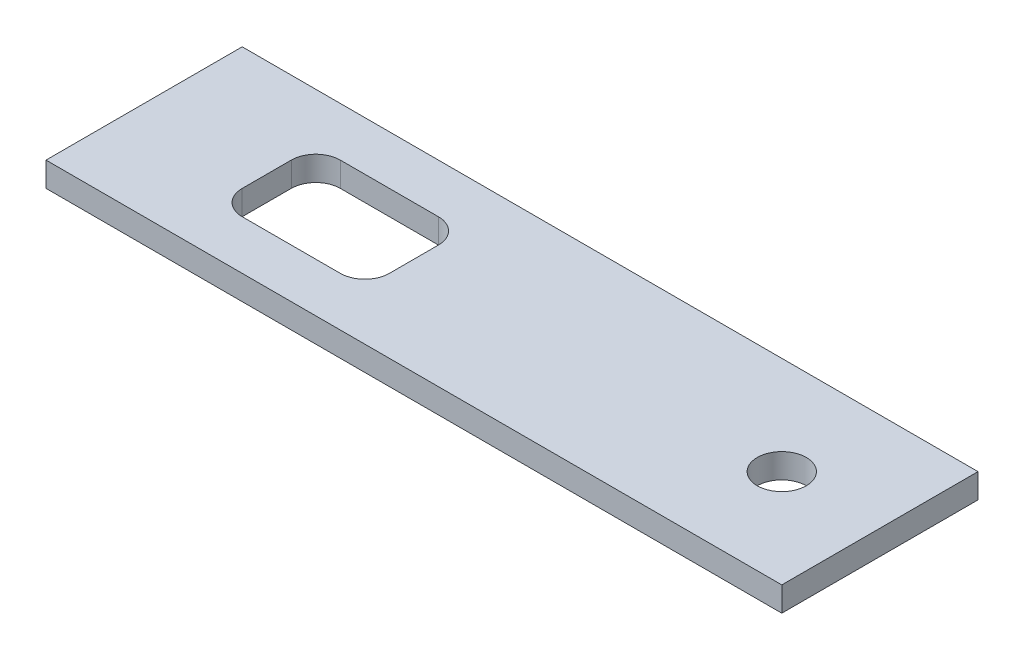
ISO-10303-21;
HEADER;
FILE_DESCRIPTION(('STEP AP214'),'2;1');
FILE_NAME('part.step','',(''),(''),'','','');
FILE_SCHEMA(('AUTOMOTIVE_DESIGN { 1 0 10303 214 1 1 1 1 }'));
ENDSEC;
DATA;
#1=APPLICATION_CONTEXT('core data for automotive mechanical design processes');
#2=APPLICATION_PROTOCOL_DEFINITION('international standard','automotive_design',2000,#1);
#3=PRODUCT_CONTEXT('',#1,'mechanical');
#4=PRODUCT('Part','Part','',(#3));
#5=PRODUCT_RELATED_PRODUCT_CATEGORY('part','',(#4));
#6=PRODUCT_DEFINITION_FORMATION('','',#4);
#7=PRODUCT_DEFINITION_CONTEXT('part definition',#1,'design');
#8=PRODUCT_DEFINITION('design','',#6,#7);
#9=PRODUCT_DEFINITION_SHAPE('','',#8);
#10=(LENGTH_UNIT() NAMED_UNIT(*) SI_UNIT(.MILLI.,.METRE.));
#11=(NAMED_UNIT(*) PLANE_ANGLE_UNIT() SI_UNIT($,.RADIAN.));
#12=(NAMED_UNIT(*) SI_UNIT($,.STERADIAN.) SOLID_ANGLE_UNIT());
#13=UNCERTAINTY_MEASURE_WITH_UNIT(LENGTH_MEASURE(1.E-05),#10,'distance_accuracy_value','');
#14=(GEOMETRIC_REPRESENTATION_CONTEXT(3) GLOBAL_UNCERTAINTY_ASSIGNED_CONTEXT((#13)) GLOBAL_UNIT_ASSIGNED_CONTEXT((#10,
#11,#12)) REPRESENTATION_CONTEXT('',''));
#15=CARTESIAN_POINT('',(0.,0.,0.));
#16=DIRECTION('',(0.,0.,1.));
#17=DIRECTION('',(1.,0.,0.));
#18=AXIS2_PLACEMENT_3D('',#15,#16,#17);
#19=CARTESIAN_POINT('',(0.,3.175,-6.35));
#20=DIRECTION('',(0.,0.,-1.));
#21=DIRECTION('',(-1.,0.,0.));
#22=AXIS2_PLACEMENT_3D('',#19,#20,#21);
#23=PLANE('',#22);
#24=DIRECTION('',(1.,0.,0.));
#25=VECTOR('',#24,1.);
#26=CARTESIAN_POINT('',(0.,0.,-6.35));
#27=LINE('',#26,#25);
#28=CARTESIAN_POINT('',(19.05,0.,-6.35));
#29=VERTEX_POINT('',#28);
#30=CARTESIAN_POINT('',(31.75,0.,-6.35));
#31=VERTEX_POINT('',#30);
#32=EDGE_CURVE('E184',#29,#31,#27,.T.);
#33=ORIENTED_EDGE('',*,*,#32,.F.);
#34=DIRECTION('',(0.,-1.,0.));
#35=VECTOR('',#34,1.);
#36=CARTESIAN_POINT('',(19.05,3.175,-6.35));
#37=LINE('',#36,#35);
#38=CARTESIAN_POINT('',(19.05,3.175,-6.35));
#39=VERTEX_POINT('',#38);
#40=EDGE_CURVE('E11',#39,#29,#37,.T.);
#41=ORIENTED_EDGE('',*,*,#40,.F.);
#42=DIRECTION('',(1.,0.,0.));
#43=VECTOR('',#42,1.);
#44=CARTESIAN_POINT('',(0.,3.175,-6.35));
#45=LINE('',#44,#43);
#46=CARTESIAN_POINT('',(31.75,3.175,-6.35));
#47=VERTEX_POINT('',#46);
#48=EDGE_CURVE('E290',#39,#47,#45,.T.);
#49=ORIENTED_EDGE('',*,*,#48,.T.);
#50=DIRECTION('',(0.,-1.,0.));
#51=VECTOR('',#50,1.);
#52=CARTESIAN_POINT('',(31.75,3.175,-6.35));
#53=LINE('',#52,#51);
#54=EDGE_CURVE('E60',#47,#31,#53,.T.);
#55=ORIENTED_EDGE('',*,*,#54,.T.);
#56=EDGE_LOOP('',(#33,#41,#49,#55));
#57=FACE_BOUND('',#56,.T.);
#58=ADVANCED_FACE('F41',(#57),#23,.T.);
#59=CARTESIAN_POINT('',(19.05,3.175,-9.525));
#60=DIRECTION('',(0.,-1.,0.));
#61=DIRECTION('',(0.,0.,-1.));
#62=AXIS2_PLACEMENT_3D('',#59,#60,#61);
#63=CYLINDRICAL_SURFACE('',#62,3.175);
#64=CARTESIAN_POINT('',(19.05,0.,-9.525));
#65=DIRECTION('',(0.,1.,0.));
#66=DIRECTION('',(0.,0.,1.));
#67=AXIS2_PLACEMENT_3D('',#64,#65,#66);
#68=CIRCLE('',#67,3.175);
#69=CARTESIAN_POINT('',(15.875,0.,-9.525));
#70=VERTEX_POINT('',#69);
#71=EDGE_CURVE('E186',#29,#70,#68,.F.);
#72=ORIENTED_EDGE('',*,*,#71,.T.);
#73=DIRECTION('',(0.,-1.,0.));
#74=VECTOR('',#73,1.);
#75=CARTESIAN_POINT('',(15.875,3.175,-9.525));
#76=LINE('',#75,#74);
#77=CARTESIAN_POINT('',(15.875,3.175,-9.525));
#78=VERTEX_POINT('',#77);
#79=EDGE_CURVE('E51',#78,#70,#76,.T.);
#80=ORIENTED_EDGE('',*,*,#79,.F.);
#81=CARTESIAN_POINT('',(19.05,3.175,-9.525));
#82=DIRECTION('',(0.,1.,0.));
#83=DIRECTION('',(0.,0.,1.));
#84=AXIS2_PLACEMENT_3D('',#81,#82,#83);
#85=CIRCLE('',#84,3.175);
#86=EDGE_CURVE('E292',#39,#78,#85,.F.);
#87=ORIENTED_EDGE('',*,*,#86,.F.);
#88=ORIENTED_EDGE('',*,*,#40,.T.);
#89=EDGE_LOOP('',(#72,#80,#87,#88));
#90=FACE_BOUND('',#89,.T.);
#91=ADVANCED_FACE('F245',(#90),#63,.F.);
#92=CARTESIAN_POINT('',(15.875,3.175,0.));
#93=DIRECTION('',(1.,0.,0.));
#94=DIRECTION('',(0.,0.,-1.));
#95=AXIS2_PLACEMENT_3D('',#92,#93,#94);
#96=PLANE('',#95);
#97=DIRECTION('',(0.,0.,1.));
#98=VECTOR('',#97,1.);
#99=CARTESIAN_POINT('',(15.875,0.,0.));
#100=LINE('',#99,#98);
#101=CARTESIAN_POINT('',(15.875,0.,-15.875));
#102=VERTEX_POINT('',#101);
#103=EDGE_CURVE('E189',#102,#70,#100,.T.);
#104=ORIENTED_EDGE('',*,*,#103,.F.);
#105=DIRECTION('',(0.,-1.,0.));
#106=VECTOR('',#105,1.);
#107=CARTESIAN_POINT('',(15.875,3.175,-15.875));
#108=LINE('',#107,#106);
#109=CARTESIAN_POINT('',(15.875,3.175,-15.875));
#110=VERTEX_POINT('',#109);
#111=EDGE_CURVE('E210',#110,#102,#108,.T.);
#112=ORIENTED_EDGE('',*,*,#111,.F.);
#113=DIRECTION('',(0.,0.,1.));
#114=VECTOR('',#113,1.);
#115=CARTESIAN_POINT('',(15.875,3.175,0.));
#116=LINE('',#115,#114);
#117=EDGE_CURVE('E294',#110,#78,#116,.T.);
#118=ORIENTED_EDGE('',*,*,#117,.T.);
#119=ORIENTED_EDGE('',*,*,#79,.T.);
#120=EDGE_LOOP('',(#104,#112,#118,#119));
#121=FACE_BOUND('',#120,.T.);
#122=ADVANCED_FACE('F250',(#121),#96,.T.);
#123=CARTESIAN_POINT('',(19.05,3.175,-15.875));
#124=DIRECTION('',(0.,-1.,0.));
#125=DIRECTION('',(0.,0.,-1.));
#126=AXIS2_PLACEMENT_3D('',#123,#124,#125);
#127=CYLINDRICAL_SURFACE('',#126,3.175);
#128=CARTESIAN_POINT('',(19.05,0.,-15.875));
#129=DIRECTION('',(0.,1.,0.));
#130=DIRECTION('',(0.,0.,1.));
#131=AXIS2_PLACEMENT_3D('',#128,#129,#130);
#132=CIRCLE('',#131,3.175);
#133=CARTESIAN_POINT('',(19.05,0.,-19.05));
#134=VERTEX_POINT('',#133);
#135=EDGE_CURVE('E192',#134,#102,#132,.T.);
#136=ORIENTED_EDGE('',*,*,#135,.F.);
#137=DIRECTION('',(0.,-1.,0.));
#138=VECTOR('',#137,1.);
#139=CARTESIAN_POINT('',(19.05,3.175,-19.05));
#140=LINE('',#139,#138);
#141=CARTESIAN_POINT('',(19.05,3.175,-19.05));
#142=VERTEX_POINT('',#141);
#143=EDGE_CURVE('E208',#142,#134,#140,.T.);
#144=ORIENTED_EDGE('',*,*,#143,.F.);
#145=CARTESIAN_POINT('',(19.05,3.175,-15.875));
#146=DIRECTION('',(0.,1.,0.));
#147=DIRECTION('',(0.,0.,1.));
#148=AXIS2_PLACEMENT_3D('',#145,#146,#147);
#149=CIRCLE('',#148,3.175);
#150=EDGE_CURVE('E163',#142,#110,#149,.T.);
#151=ORIENTED_EDGE('',*,*,#150,.T.);
#152=ORIENTED_EDGE('',*,*,#111,.T.);
#153=EDGE_LOOP('',(#136,#144,#151,#152));
#154=FACE_BOUND('',#153,.T.);
#155=ADVANCED_FACE('F256',(#154),#127,.F.);
#156=CARTESIAN_POINT('',(0.,3.175,-19.05));
#157=DIRECTION('',(0.,0.,-1.));
#158=DIRECTION('',(-1.,0.,0.));
#159=AXIS2_PLACEMENT_3D('',#156,#157,#158);
#160=PLANE('',#159);
#161=DIRECTION('',(1.,0.,0.));
#162=VECTOR('',#161,1.);
#163=CARTESIAN_POINT('',(0.,0.,-19.05));
#164=LINE('',#163,#162);
#165=CARTESIAN_POINT('',(31.75,0.,-19.05));
#166=VERTEX_POINT('',#165);
#167=EDGE_CURVE('E195',#134,#166,#164,.T.);
#168=ORIENTED_EDGE('',*,*,#167,.T.);
#169=DIRECTION('',(0.,-1.,0.));
#170=VECTOR('',#169,1.);
#171=CARTESIAN_POINT('',(31.75,3.175,-19.05));
#172=LINE('',#171,#170);
#173=CARTESIAN_POINT('',(31.75,3.175,-19.05));
#174=VERTEX_POINT('',#173);
#175=EDGE_CURVE('E148',#174,#166,#172,.T.);
#176=ORIENTED_EDGE('',*,*,#175,.F.);
#177=DIRECTION('',(1.,0.,0.));
#178=VECTOR('',#177,1.);
#179=CARTESIAN_POINT('',(0.,3.175,-19.05));
#180=LINE('',#179,#178);
#181=EDGE_CURVE('E160',#142,#174,#180,.T.);
#182=ORIENTED_EDGE('',*,*,#181,.F.);
#183=ORIENTED_EDGE('',*,*,#143,.T.);
#184=EDGE_LOOP('',(#168,#176,#182,#183));
#185=FACE_BOUND('',#184,.T.);
#186=ADVANCED_FACE('F260',(#185),#160,.F.);
#187=CARTESIAN_POINT('',(31.75,3.175,-15.875));
#188=DIRECTION('',(0.,-1.,0.));
#189=DIRECTION('',(0.,0.,-1.));
#190=AXIS2_PLACEMENT_3D('',#187,#188,#189);
#191=CYLINDRICAL_SURFACE('',#190,3.175);
#192=CARTESIAN_POINT('',(31.75,0.,-15.875));
#193=DIRECTION('',(0.,1.,0.));
#194=DIRECTION('',(0.,0.,1.));
#195=AXIS2_PLACEMENT_3D('',#192,#193,#194);
#196=CIRCLE('',#195,3.175);
#197=CARTESIAN_POINT('',(34.925,0.,-15.875));
#198=VERTEX_POINT('',#197);
#199=EDGE_CURVE('E145',#198,#166,#196,.T.);
#200=ORIENTED_EDGE('',*,*,#199,.F.);
#201=DIRECTION('',(0.,-1.,0.));
#202=VECTOR('',#201,1.);
#203=CARTESIAN_POINT('',(34.925,3.175,-15.875));
#204=LINE('',#203,#202);
#205=CARTESIAN_POINT('',(34.925,3.175,-15.875));
#206=VERTEX_POINT('',#205);
#207=EDGE_CURVE('E139',#206,#198,#204,.T.);
#208=ORIENTED_EDGE('',*,*,#207,.F.);
#209=CARTESIAN_POINT('',(31.75,3.175,-15.875));
#210=DIRECTION('',(0.,1.,0.));
#211=DIRECTION('',(0.,0.,1.));
#212=AXIS2_PLACEMENT_3D('',#209,#210,#211);
#213=CIRCLE('',#212,3.175);
#214=EDGE_CURVE('E143',#206,#174,#213,.T.);
#215=ORIENTED_EDGE('',*,*,#214,.T.);
#216=ORIENTED_EDGE('',*,*,#175,.T.);
#217=EDGE_LOOP('',(#200,#208,#215,#216));
#218=FACE_BOUND('',#217,.T.);
#219=ADVANCED_FACE('F141',(#218),#191,.F.);
#220=CARTESIAN_POINT('',(34.925,3.175,0.));
#221=DIRECTION('',(1.,0.,0.));
#222=DIRECTION('',(0.,0.,-1.));
#223=AXIS2_PLACEMENT_3D('',#220,#221,#222);
#224=PLANE('',#223);
#225=DIRECTION('',(0.,0.,1.));
#226=VECTOR('',#225,1.);
#227=CARTESIAN_POINT('',(34.925,0.,0.));
#228=LINE('',#227,#226);
#229=CARTESIAN_POINT('',(34.925,0.,-9.525));
#230=VERTEX_POINT('',#229);
#231=EDGE_CURVE('E199',#198,#230,#228,.T.);
#232=ORIENTED_EDGE('',*,*,#231,.T.);
#233=DIRECTION('',(0.,-1.,0.));
#234=VECTOR('',#233,1.);
#235=CARTESIAN_POINT('',(34.925,3.175,-9.525));
#236=LINE('',#235,#234);
#237=CARTESIAN_POINT('',(34.925,3.175,-9.525));
#238=VERTEX_POINT('',#237);
#239=EDGE_CURVE('E98',#238,#230,#236,.T.);
#240=ORIENTED_EDGE('',*,*,#239,.F.);
#241=DIRECTION('',(0.,0.,1.));
#242=VECTOR('',#241,1.);
#243=CARTESIAN_POINT('',(34.925,3.175,0.));
#244=LINE('',#243,#242);
#245=EDGE_CURVE('E150',#206,#238,#244,.T.);
#246=ORIENTED_EDGE('',*,*,#245,.F.);
#247=ORIENTED_EDGE('',*,*,#207,.T.);
#248=EDGE_LOOP('',(#232,#240,#246,#247));
#249=FACE_BOUND('',#248,.T.);
#250=ADVANCED_FACE('F151',(#249),#224,.F.);
#251=CARTESIAN_POINT('',(0.,3.175,0.));
#252=DIRECTION('',(0.,0.,-1.));
#253=DIRECTION('',(-1.,0.,0.));
#254=AXIS2_PLACEMENT_3D('',#251,#252,#253);
#255=PLANE('',#254);
#256=DIRECTION('',(1.,0.,0.));
#257=VECTOR('',#256,1.);
#258=CARTESIAN_POINT('',(0.,0.,0.));
#259=LINE('',#258,#257);
#260=CARTESIAN_POINT('',(0.,0.,0.));
#261=VERTEX_POINT('',#260);
#262=CARTESIAN_POINT('',(95.25,0.,0.));
#263=VERTEX_POINT('',#262);
#264=EDGE_CURVE('E172',#261,#263,#259,.T.);
#265=ORIENTED_EDGE('',*,*,#264,.T.);
#266=DIRECTION('',(0.,-1.,0.));
#267=VECTOR('',#266,1.);
#268=CARTESIAN_POINT('',(95.25,3.175,0.));
#269=LINE('',#268,#267);
#270=CARTESIAN_POINT('',(95.25,3.175,0.));
#271=VERTEX_POINT('',#270);
#272=EDGE_CURVE('E45',#271,#263,#269,.T.);
#273=ORIENTED_EDGE('',*,*,#272,.F.);
#274=DIRECTION('',(1.,0.,0.));
#275=VECTOR('',#274,1.);
#276=CARTESIAN_POINT('',(0.,3.175,0.));
#277=LINE('',#276,#275);
#278=CARTESIAN_POINT('',(0.,3.175,0.));
#279=VERTEX_POINT('',#278);
#280=EDGE_CURVE('E282',#279,#271,#277,.T.);
#281=ORIENTED_EDGE('',*,*,#280,.F.);
#282=DIRECTION('',(0.,-1.,0.));
#283=VECTOR('',#282,1.);
#284=CARTESIAN_POINT('',(0.,3.175,0.));
#285=LINE('',#284,#283);
#286=EDGE_CURVE('E168',#279,#261,#285,.T.);
#287=ORIENTED_EDGE('',*,*,#286,.T.);
#288=EDGE_LOOP('',(#265,#273,#281,#287));
#289=FACE_BOUND('',#288,.T.);
#290=ADVANCED_FACE('F224',(#289),#255,.F.);
#291=CARTESIAN_POINT('',(95.25,3.175,0.));
#292=DIRECTION('',(-1.,0.,0.));
#293=DIRECTION('',(0.,0.,1.));
#294=AXIS2_PLACEMENT_3D('',#291,#292,#293);
#295=PLANE('',#294);
#296=DIRECTION('',(0.,0.,-1.));
#297=VECTOR('',#296,1.);
#298=CARTESIAN_POINT('',(95.25,0.,0.));
#299=LINE('',#298,#297);
#300=CARTESIAN_POINT('',(95.25,0.,-25.4));
#301=VERTEX_POINT('',#300);
#302=EDGE_CURVE('E175',#263,#301,#299,.T.);
#303=ORIENTED_EDGE('',*,*,#302,.T.);
#304=DIRECTION('',(0.,-1.,0.));
#305=VECTOR('',#304,1.);
#306=CARTESIAN_POINT('',(95.25,3.175,-25.4));
#307=LINE('',#306,#305);
#308=CARTESIAN_POINT('',(95.25,3.175,-25.4));
#309=VERTEX_POINT('',#308);
#310=EDGE_CURVE('E215',#309,#301,#307,.T.);
#311=ORIENTED_EDGE('',*,*,#310,.F.);
#312=DIRECTION('',(0.,0.,-1.));
#313=VECTOR('',#312,1.);
#314=CARTESIAN_POINT('',(95.25,3.175,0.));
#315=LINE('',#314,#313);
#316=EDGE_CURVE('E111',#271,#309,#315,.T.);
#317=ORIENTED_EDGE('',*,*,#316,.F.);
#318=ORIENTED_EDGE('',*,*,#272,.T.);
#319=EDGE_LOOP('',(#303,#311,#317,#318));
#320=FACE_BOUND('',#319,.T.);
#321=ADVANCED_FACE('F220',(#320),#295,.F.);
#322=CARTESIAN_POINT('',(0.,3.175,-25.4));
#323=DIRECTION('',(0.,0.,-1.));
#324=DIRECTION('',(-1.,0.,0.));
#325=AXIS2_PLACEMENT_3D('',#322,#323,#324);
#326=PLANE('',#325);
#327=DIRECTION('',(1.,0.,0.));
#328=VECTOR('',#327,1.);
#329=CARTESIAN_POINT('',(0.,0.,-25.4));
#330=LINE('',#329,#328);
#331=CARTESIAN_POINT('',(0.,0.,-25.4));
#332=VERTEX_POINT('',#331);
#333=EDGE_CURVE('E178',#332,#301,#330,.T.);
#334=ORIENTED_EDGE('',*,*,#333,.F.);
#335=DIRECTION('',(0.,-1.,0.));
#336=VECTOR('',#335,1.);
#337=CARTESIAN_POINT('',(0.,3.175,-25.4));
#338=LINE('',#337,#336);
#339=CARTESIAN_POINT('',(0.,3.175,-25.4));
#340=VERTEX_POINT('',#339);
#341=EDGE_CURVE('E214',#340,#332,#338,.T.);
#342=ORIENTED_EDGE('',*,*,#341,.F.);
#343=DIRECTION('',(1.,0.,0.));
#344=VECTOR('',#343,1.);
#345=CARTESIAN_POINT('',(0.,3.175,-25.4));
#346=LINE('',#345,#344);
#347=EDGE_CURVE('E284',#340,#309,#346,.T.);
#348=ORIENTED_EDGE('',*,*,#347,.T.);
#349=ORIENTED_EDGE('',*,*,#310,.T.);
#350=EDGE_LOOP('',(#334,#342,#348,#349));
#351=FACE_BOUND('',#350,.T.);
#352=ADVANCED_FACE('F235',(#351),#326,.T.);
#353=CARTESIAN_POINT('',(0.,3.175,0.));
#354=DIRECTION('',(-1.,0.,0.));
#355=DIRECTION('',(0.,0.,1.));
#356=AXIS2_PLACEMENT_3D('',#353,#354,#355);
#357=PLANE('',#356);
#358=DIRECTION('',(0.,0.,-1.));
#359=VECTOR('',#358,1.);
#360=CARTESIAN_POINT('',(0.,0.,0.));
#361=LINE('',#360,#359);
#362=EDGE_CURVE('E181',#261,#332,#361,.T.);
#363=ORIENTED_EDGE('',*,*,#362,.F.);
#364=ORIENTED_EDGE('',*,*,#286,.F.);
#365=DIRECTION('',(0.,0.,-1.));
#366=VECTOR('',#365,1.);
#367=CARTESIAN_POINT('',(0.,3.175,0.));
#368=LINE('',#367,#366);
#369=EDGE_CURVE('E233',#279,#340,#368,.T.);
#370=ORIENTED_EDGE('',*,*,#369,.T.);
#371=ORIENTED_EDGE('',*,*,#341,.T.);
#372=EDGE_LOOP('',(#363,#364,#370,#371));
#373=FACE_BOUND('',#372,.T.);
#374=ADVANCED_FACE('F230',(#373),#357,.T.);
#375=CARTESIAN_POINT('',(82.55,3.175,-12.7));
#376=DIRECTION('',(0.,-1.,0.));
#377=DIRECTION('',(0.,0.,-1.));
#378=AXIS2_PLACEMENT_3D('',#375,#376,#377);
#379=CYLINDRICAL_SURFACE('',#378,3.175);
#380=CARTESIAN_POINT('',(82.55,3.175,-12.7));
#381=DIRECTION('',(0.,1.,0.));
#382=DIRECTION('',(0.,0.,1.));
#383=AXIS2_PLACEMENT_3D('',#380,#381,#382);
#384=CIRCLE('',#383,3.175);
#385=CARTESIAN_POINT('',(82.55,3.175,-9.525));
#386=VERTEX_POINT('',#385);
#387=EDGE_CURVE('E204',#386,#386,#384,.T.);
#388=ORIENTED_EDGE('',*,*,#387,.T.);
#389=EDGE_LOOP('',(#388));
#390=FACE_BOUND('',#389,.T.);
#391=CARTESIAN_POINT('',(82.55,0.,-12.7));
#392=DIRECTION('',(0.,1.,0.));
#393=DIRECTION('',(0.,0.,1.));
#394=AXIS2_PLACEMENT_3D('',#391,#392,#393);
#395=CIRCLE('',#394,3.175);
#396=CARTESIAN_POINT('',(82.55,0.,-9.525));
#397=VERTEX_POINT('',#396);
#398=EDGE_CURVE('E169',#397,#397,#395,.T.);
#399=ORIENTED_EDGE('',*,*,#398,.F.);
#400=EDGE_LOOP('',(#399));
#401=FACE_BOUND('',#400,.T.);
#402=ADVANCED_FACE('F43',(#390,#401),#379,.F.);
#403=CARTESIAN_POINT('',(31.75,3.175,-9.525));
#404=DIRECTION('',(0.,-1.,0.));
#405=DIRECTION('',(0.,0.,-1.));
#406=AXIS2_PLACEMENT_3D('',#403,#404,#405);
#407=CYLINDRICAL_SURFACE('',#406,3.175);
#408=CARTESIAN_POINT('',(31.75,0.,-9.525));
#409=DIRECTION('',(0.,1.,0.));
#410=DIRECTION('',(0.,0.,1.));
#411=AXIS2_PLACEMENT_3D('',#408,#409,#410);
#412=CIRCLE('',#411,3.175);
#413=EDGE_CURVE('E201',#31,#230,#412,.T.);
#414=ORIENTED_EDGE('',*,*,#413,.F.);
#415=ORIENTED_EDGE('',*,*,#54,.F.);
#416=CARTESIAN_POINT('',(31.75,3.175,-9.525));
#417=DIRECTION('',(0.,1.,0.));
#418=DIRECTION('',(0.,0.,1.));
#419=AXIS2_PLACEMENT_3D('',#416,#417,#418);
#420=CIRCLE('',#419,3.175);
#421=EDGE_CURVE('E154',#47,#238,#420,.T.);
#422=ORIENTED_EDGE('',*,*,#421,.T.);
#423=ORIENTED_EDGE('',*,*,#239,.T.);
#424=EDGE_LOOP('',(#414,#415,#422,#423));
#425=FACE_BOUND('',#424,.T.);
#426=ADVANCED_FACE('F269',(#425),#407,.F.);
#427=CARTESIAN_POINT('',(0.,3.175,0.));
#428=DIRECTION('',(0.,1.,0.));
#429=DIRECTION('',(0.,0.,1.));
#430=AXIS2_PLACEMENT_3D('',#427,#428,#429);
#431=PLANE('',#430);
#432=ORIENTED_EDGE('',*,*,#387,.F.);
#433=EDGE_LOOP('',(#432));
#434=FACE_BOUND('',#433,.T.);
#435=ORIENTED_EDGE('',*,*,#280,.T.);
#436=ORIENTED_EDGE('',*,*,#316,.T.);
#437=ORIENTED_EDGE('',*,*,#347,.F.);
#438=ORIENTED_EDGE('',*,*,#369,.F.);
#439=EDGE_LOOP('',(#435,#436,#437,#438));
#440=FACE_BOUND('',#439,.T.);
#441=ORIENTED_EDGE('',*,*,#48,.F.);
#442=ORIENTED_EDGE('',*,*,#86,.T.);
#443=ORIENTED_EDGE('',*,*,#117,.F.);
#444=ORIENTED_EDGE('',*,*,#150,.F.);
#445=ORIENTED_EDGE('',*,*,#181,.T.);
#446=ORIENTED_EDGE('',*,*,#214,.F.);
#447=ORIENTED_EDGE('',*,*,#245,.T.);
#448=ORIENTED_EDGE('',*,*,#421,.F.);
#449=EDGE_LOOP('',(#441,#442,#443,#444,#445,#446,#447,#448));
#450=FACE_BOUND('',#449,.T.);
#451=ADVANCED_FACE('F157',(#434,#440,#450),#431,.T.);
#452=CARTESIAN_POINT('',(0.,0.,0.));
#453=DIRECTION('',(0.,1.,0.));
#454=DIRECTION('',(0.,0.,1.));
#455=AXIS2_PLACEMENT_3D('',#452,#453,#454);
#456=PLANE('',#455);
#457=ORIENTED_EDGE('',*,*,#398,.T.);
#458=EDGE_LOOP('',(#457));
#459=FACE_BOUND('',#458,.T.);
#460=ORIENTED_EDGE('',*,*,#264,.F.);
#461=ORIENTED_EDGE('',*,*,#362,.T.);
#462=ORIENTED_EDGE('',*,*,#333,.T.);
#463=ORIENTED_EDGE('',*,*,#302,.F.);
#464=EDGE_LOOP('',(#460,#461,#462,#463));
#465=FACE_BOUND('',#464,.T.);
#466=ORIENTED_EDGE('',*,*,#32,.T.);
#467=ORIENTED_EDGE('',*,*,#413,.T.);
#468=ORIENTED_EDGE('',*,*,#231,.F.);
#469=ORIENTED_EDGE('',*,*,#199,.T.);
#470=ORIENTED_EDGE('',*,*,#167,.F.);
#471=ORIENTED_EDGE('',*,*,#135,.T.);
#472=ORIENTED_EDGE('',*,*,#103,.T.);
#473=ORIENTED_EDGE('',*,*,#71,.F.);
#474=EDGE_LOOP('',(#466,#467,#468,#469,#470,#471,#472,#473));
#475=FACE_BOUND('',#474,.T.);
#476=ADVANCED_FACE('F227',(#459,#465,#475),#456,.F.);
#477=CLOSED_SHELL('',(#58,#91,#122,#155,#186,#219,#250,#290,#321,#352,#374,#402,#426,#451,#476));
#478=MANIFOLD_SOLID_BREP('B2',#477);
#479=ADVANCED_BREP_SHAPE_REPRESENTATION('',(#18,#478),#14);
#480=SHAPE_DEFINITION_REPRESENTATION(#9,#479);
ENDSEC;
END-ISO-10303-21;
